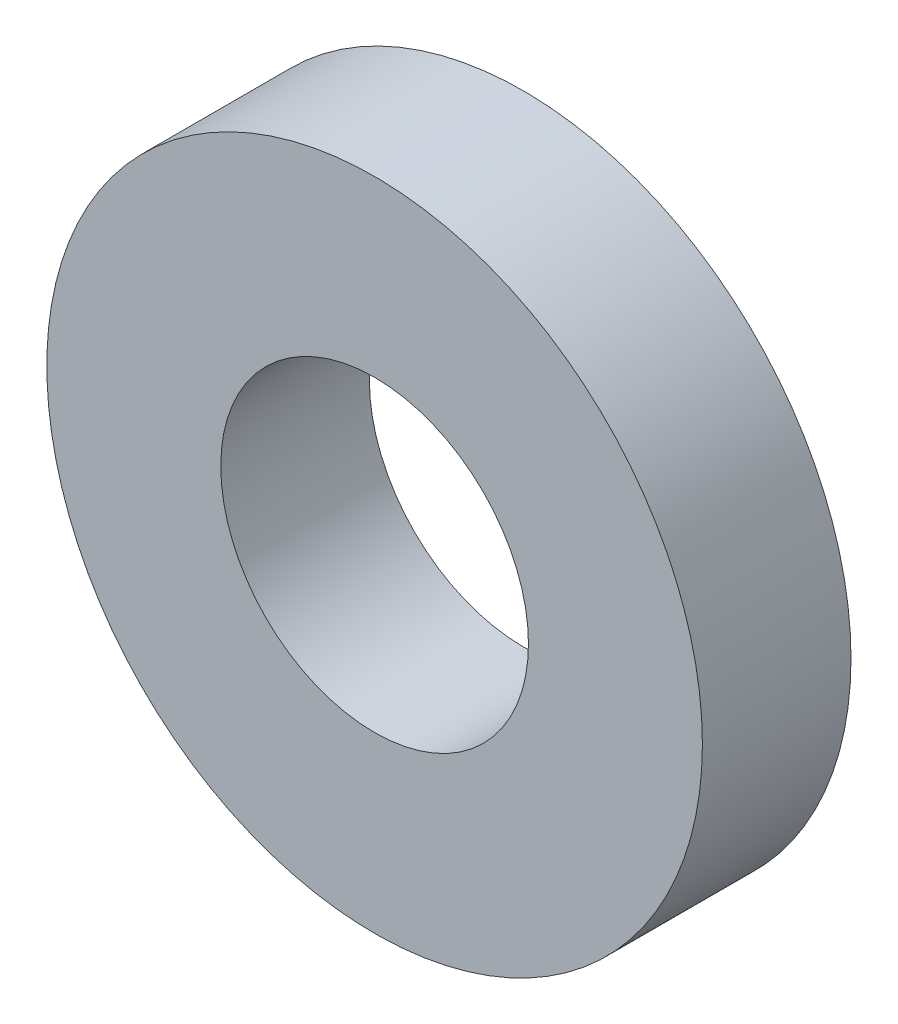
ISO-10303-21;
HEADER;
FILE_DESCRIPTION(('STEP AP214'),'2;1');
FILE_NAME('part.step','',(''),(''),'','','');
FILE_SCHEMA(('AUTOMOTIVE_DESIGN { 1 0 10303 214 1 1 1 1 }'));
ENDSEC;
DATA;
#1=APPLICATION_CONTEXT('core data for automotive mechanical design processes');
#2=APPLICATION_PROTOCOL_DEFINITION('international standard','automotive_design',2000,#1);
#3=PRODUCT_CONTEXT('',#1,'mechanical');
#4=PRODUCT('Part','Part','',(#3));
#5=PRODUCT_RELATED_PRODUCT_CATEGORY('part','',(#4));
#6=PRODUCT_DEFINITION_FORMATION('','',#4);
#7=PRODUCT_DEFINITION_CONTEXT('part definition',#1,'design');
#8=PRODUCT_DEFINITION('design','',#6,#7);
#9=PRODUCT_DEFINITION_SHAPE('','',#8);
#10=(LENGTH_UNIT() NAMED_UNIT(*) SI_UNIT(.MILLI.,.METRE.));
#11=(NAMED_UNIT(*) PLANE_ANGLE_UNIT() SI_UNIT($,.RADIAN.));
#12=(NAMED_UNIT(*) SI_UNIT($,.STERADIAN.) SOLID_ANGLE_UNIT());
#13=UNCERTAINTY_MEASURE_WITH_UNIT(LENGTH_MEASURE(1.E-05),#10,'distance_accuracy_value','');
#14=(GEOMETRIC_REPRESENTATION_CONTEXT(3) GLOBAL_UNCERTAINTY_ASSIGNED_CONTEXT((#13)) GLOBAL_UNIT_ASSIGNED_CONTEXT((#10,
#11,#12)) REPRESENTATION_CONTEXT('',''));
#15=CARTESIAN_POINT('',(0.,0.,0.));
#16=DIRECTION('',(0.,0.,1.));
#17=DIRECTION('',(1.,0.,0.));
#18=AXIS2_PLACEMENT_3D('',#15,#16,#17);
#19=CARTESIAN_POINT('',(0.,0.,8.5));
#20=DIRECTION('',(0.,0.,1.));
#21=DIRECTION('',(1.,0.,0.));
#22=AXIS2_PLACEMENT_3D('',#19,#20,#21);
#23=PLANE('',#22);
#24=CARTESIAN_POINT('',(0.,0.,8.5));
#25=DIRECTION('',(0.,0.,1.));
#26=DIRECTION('',(1.,0.,0.));
#27=AXIS2_PLACEMENT_3D('',#24,#25,#26);
#28=CIRCLE('',#27,37.5);
#29=CARTESIAN_POINT('',(37.5,0.,8.5));
#30=VERTEX_POINT('',#29);
#31=EDGE_CURVE('E10',#30,#30,#28,.T.);
#32=ORIENTED_EDGE('',*,*,#31,.T.);
#33=EDGE_LOOP('',(#32));
#34=FACE_BOUND('',#33,.T.);
#35=CARTESIAN_POINT('',(0.,0.,8.5));
#36=DIRECTION('',(0.,0.,1.));
#37=DIRECTION('',(1.,0.,0.));
#38=AXIS2_PLACEMENT_3D('',#35,#36,#37);
#39=CIRCLE('',#38,17.6);
#40=CARTESIAN_POINT('',(17.6,0.,8.5));
#41=VERTEX_POINT('',#40);
#42=EDGE_CURVE('E50',#41,#41,#39,.T.);
#43=ORIENTED_EDGE('',*,*,#42,.F.);
#44=EDGE_LOOP('',(#43));
#45=FACE_BOUND('',#44,.T.);
#46=ADVANCED_FACE('F37',(#34,#45),#23,.T.);
#47=CARTESIAN_POINT('',(0.,0.,-8.5));
#48=DIRECTION('',(0.,0.,1.));
#49=DIRECTION('',(1.,0.,0.));
#50=AXIS2_PLACEMENT_3D('',#47,#48,#49);
#51=PLANE('',#50);
#52=CARTESIAN_POINT('',(0.,0.,-8.5));
#53=DIRECTION('',(0.,0.,1.));
#54=DIRECTION('',(1.,0.,0.));
#55=AXIS2_PLACEMENT_3D('',#52,#53,#54);
#56=CIRCLE('',#55,37.5);
#57=CARTESIAN_POINT('',(37.5,0.,-8.5));
#58=VERTEX_POINT('',#57);
#59=EDGE_CURVE('E41',#58,#58,#56,.T.);
#60=ORIENTED_EDGE('',*,*,#59,.F.);
#61=EDGE_LOOP('',(#60));
#62=FACE_BOUND('',#61,.T.);
#63=CARTESIAN_POINT('',(0.,0.,-8.5));
#64=DIRECTION('',(0.,0.,1.));
#65=DIRECTION('',(1.,0.,0.));
#66=AXIS2_PLACEMENT_3D('',#63,#64,#65);
#67=CIRCLE('',#66,17.6);
#68=CARTESIAN_POINT('',(17.6,0.,-8.5));
#69=VERTEX_POINT('',#68);
#70=EDGE_CURVE('E52',#69,#69,#67,.T.);
#71=ORIENTED_EDGE('',*,*,#70,.T.);
#72=EDGE_LOOP('',(#71));
#73=FACE_BOUND('',#72,.T.);
#74=ADVANCED_FACE('F64',(#62,#73),#51,.F.);
#75=CARTESIAN_POINT('',(0.,0.,8.5));
#76=DIRECTION('',(0.,0.,-1.));
#77=DIRECTION('',(-1.,0.,0.));
#78=AXIS2_PLACEMENT_3D('',#75,#76,#77);
#79=CYLINDRICAL_SURFACE('',#78,37.5);
#80=ORIENTED_EDGE('',*,*,#31,.F.);
#81=EDGE_LOOP('',(#80));
#82=FACE_BOUND('',#81,.T.);
#83=ORIENTED_EDGE('',*,*,#59,.T.);
#84=EDGE_LOOP('',(#83));
#85=FACE_BOUND('',#84,.T.);
#86=ADVANCED_FACE('F39',(#82,#85),#79,.T.);
#87=CARTESIAN_POINT('',(0.,0.,8.5));
#88=DIRECTION('',(0.,0.,-1.));
#89=DIRECTION('',(-1.,0.,0.));
#90=AXIS2_PLACEMENT_3D('',#87,#88,#89);
#91=CYLINDRICAL_SURFACE('',#90,17.6);
#92=ORIENTED_EDGE('',*,*,#42,.T.);
#93=EDGE_LOOP('',(#92));
#94=FACE_BOUND('',#93,.T.);
#95=ORIENTED_EDGE('',*,*,#70,.F.);
#96=EDGE_LOOP('',(#95));
#97=FACE_BOUND('',#96,.T.);
#98=ADVANCED_FACE('F60',(#94,#97),#91,.F.);
#99=CLOSED_SHELL('',(#46,#74,#86,#98));
#100=MANIFOLD_SOLID_BREP('B2',#99);
#101=ADVANCED_BREP_SHAPE_REPRESENTATION('',(#18,#100),#14);
#102=SHAPE_DEFINITION_REPRESENTATION(#9,#101);
ENDSEC;
END-ISO-10303-21;
